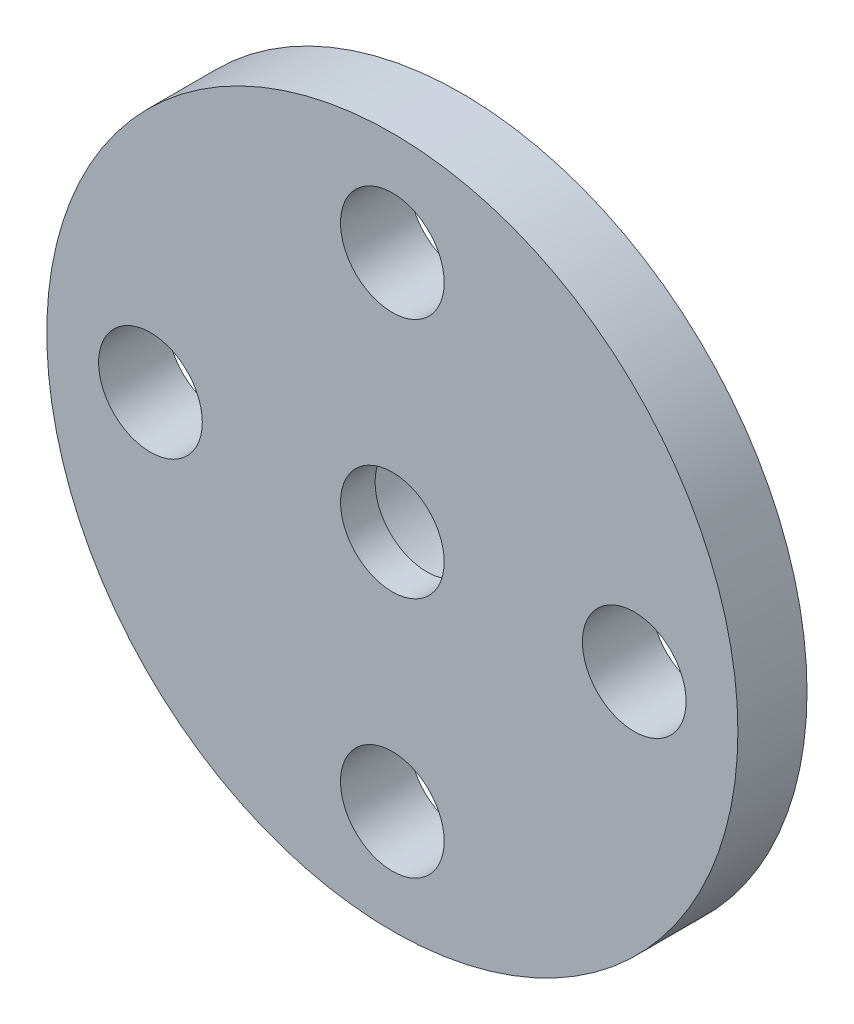
ISO-10303-21;
HEADER;
FILE_DESCRIPTION(('STEP AP214'),'2;1');
FILE_NAME('part.step','',(''),(''),'','','');
FILE_SCHEMA(('AUTOMOTIVE_DESIGN { 1 0 10303 214 1 1 1 1 }'));
ENDSEC;
DATA;
#1=APPLICATION_CONTEXT('core data for automotive mechanical design processes');
#2=APPLICATION_PROTOCOL_DEFINITION('international standard','automotive_design',2000,#1);
#3=PRODUCT_CONTEXT('',#1,'mechanical');
#4=PRODUCT('Part','Part','',(#3));
#5=PRODUCT_RELATED_PRODUCT_CATEGORY('part','',(#4));
#6=PRODUCT_DEFINITION_FORMATION('','',#4);
#7=PRODUCT_DEFINITION_CONTEXT('part definition',#1,'design');
#8=PRODUCT_DEFINITION('design','',#6,#7);
#9=PRODUCT_DEFINITION_SHAPE('','',#8);
#10=(LENGTH_UNIT() NAMED_UNIT(*) SI_UNIT(.MILLI.,.METRE.));
#11=(NAMED_UNIT(*) PLANE_ANGLE_UNIT() SI_UNIT($,.RADIAN.));
#12=(NAMED_UNIT(*) SI_UNIT($,.STERADIAN.) SOLID_ANGLE_UNIT());
#13=UNCERTAINTY_MEASURE_WITH_UNIT(LENGTH_MEASURE(1.E-05),#10,'distance_accuracy_value','');
#14=(GEOMETRIC_REPRESENTATION_CONTEXT(3) GLOBAL_UNCERTAINTY_ASSIGNED_CONTEXT((#13)) GLOBAL_UNIT_ASSIGNED_CONTEXT((#10,
#11,#12)) REPRESENTATION_CONTEXT('',''));
#15=CARTESIAN_POINT('',(0.,0.,0.));
#16=DIRECTION('',(0.,0.,1.));
#17=DIRECTION('',(1.,0.,0.));
#18=AXIS2_PLACEMENT_3D('',#15,#16,#17);
#19=CARTESIAN_POINT('',(0.,0.,2.));
#20=DIRECTION('',(0.,0.,-1.));
#21=DIRECTION('',(-1.,0.,0.));
#22=AXIS2_PLACEMENT_3D('',#19,#20,#21);
#23=CYLINDRICAL_SURFACE('',#22,1.5);
#24=CARTESIAN_POINT('',(0.,0.,2.));
#25=DIRECTION('',(0.,0.,1.));
#26=DIRECTION('',(1.,0.,0.));
#27=AXIS2_PLACEMENT_3D('',#24,#25,#26);
#28=CIRCLE('',#27,1.5);
#29=CARTESIAN_POINT('',(1.5,0.,2.));
#30=VERTEX_POINT('',#29);
#31=EDGE_CURVE('E47',#30,#30,#28,.T.);
#32=ORIENTED_EDGE('',*,*,#31,.T.);
#33=EDGE_LOOP('',(#32));
#34=FACE_BOUND('',#33,.T.);
#35=CARTESIAN_POINT('',(0.,0.,1.));
#36=DIRECTION('',(0.,0.,-1.));
#37=DIRECTION('',(-1.,0.,0.));
#38=AXIS2_PLACEMENT_3D('',#35,#36,#37);
#39=CIRCLE('',#38,1.5);
#40=CARTESIAN_POINT('',(-1.5,0.,1.));
#41=VERTEX_POINT('',#40);
#42=EDGE_CURVE('E38',#41,#41,#39,.T.);
#43=ORIENTED_EDGE('',*,*,#42,.T.);
#44=EDGE_LOOP('',(#43));
#45=FACE_BOUND('',#44,.T.);
#46=ADVANCED_FACE('F34',(#34,#45),#23,.F.);
#47=CARTESIAN_POINT('',(0.,0.,2.));
#48=DIRECTION('',(0.,0.,1.));
#49=DIRECTION('',(1.,0.,0.));
#50=AXIS2_PLACEMENT_3D('',#47,#48,#49);
#51=PLANE('',#50);
#52=CARTESIAN_POINT('',(0.,7.,2.));
#53=DIRECTION('',(0.,0.,1.));
#54=DIRECTION('',(1.,0.,0.));
#55=AXIS2_PLACEMENT_3D('',#52,#53,#54);
#56=CIRCLE('',#55,1.5);
#57=CARTESIAN_POINT('',(1.5,7.,2.));
#58=VERTEX_POINT('',#57);
#59=EDGE_CURVE('E61',#58,#58,#56,.T.);
#60=ORIENTED_EDGE('',*,*,#59,.F.);
#61=EDGE_LOOP('',(#60));
#62=FACE_BOUND('',#61,.T.);
#63=CARTESIAN_POINT('',(-7.,0.,2.));
#64=DIRECTION('',(0.,0.,1.));
#65=DIRECTION('',(1.,0.,0.));
#66=AXIS2_PLACEMENT_3D('',#63,#64,#65);
#67=CIRCLE('',#66,1.5);
#68=CARTESIAN_POINT('',(-5.5,0.,2.));
#69=VERTEX_POINT('',#68);
#70=EDGE_CURVE('E51',#69,#69,#67,.T.);
#71=ORIENTED_EDGE('',*,*,#70,.F.);
#72=EDGE_LOOP('',(#71));
#73=FACE_BOUND('',#72,.T.);
#74=CARTESIAN_POINT('',(0.,0.,2.));
#75=DIRECTION('',(0.,0.,1.));
#76=DIRECTION('',(1.,0.,0.));
#77=AXIS2_PLACEMENT_3D('',#74,#75,#76);
#78=CIRCLE('',#77,10.);
#79=CARTESIAN_POINT('',(10.,0.,2.));
#80=VERTEX_POINT('',#79);
#81=EDGE_CURVE('E10',#80,#80,#78,.T.);
#82=ORIENTED_EDGE('',*,*,#81,.T.);
#83=EDGE_LOOP('',(#82));
#84=FACE_BOUND('',#83,.T.);
#85=ORIENTED_EDGE('',*,*,#31,.F.);
#86=EDGE_LOOP('',(#85));
#87=FACE_BOUND('',#86,.T.);
#88=CARTESIAN_POINT('',(7.,0.,2.));
#89=DIRECTION('',(0.,0.,1.));
#90=DIRECTION('',(1.,0.,0.));
#91=AXIS2_PLACEMENT_3D('',#88,#89,#90);
#92=CIRCLE('',#91,1.5);
#93=CARTESIAN_POINT('',(8.5,0.,2.));
#94=VERTEX_POINT('',#93);
#95=EDGE_CURVE('E55',#94,#94,#92,.T.);
#96=ORIENTED_EDGE('',*,*,#95,.F.);
#97=EDGE_LOOP('',(#96));
#98=FACE_BOUND('',#97,.T.);
#99=CARTESIAN_POINT('',(0.,-7.,2.));
#100=DIRECTION('',(0.,0.,1.));
#101=DIRECTION('',(1.,0.,0.));
#102=AXIS2_PLACEMENT_3D('',#99,#100,#101);
#103=CIRCLE('',#102,1.5);
#104=CARTESIAN_POINT('',(1.5,-7.,2.));
#105=VERTEX_POINT('',#104);
#106=EDGE_CURVE('E67',#105,#105,#103,.T.);
#107=ORIENTED_EDGE('',*,*,#106,.F.);
#108=EDGE_LOOP('',(#107));
#109=FACE_BOUND('',#108,.T.);
#110=ADVANCED_FACE('F103',(#62,#73,#84,#87,#98,#109),#51,.T.);
#111=CARTESIAN_POINT('',(0.,0.,0.));
#112=DIRECTION('',(0.,0.,1.));
#113=DIRECTION('',(1.,0.,0.));
#114=AXIS2_PLACEMENT_3D('',#111,#112,#113);
#115=PLANE('',#114);
#116=CARTESIAN_POINT('',(0.,0.,0.));
#117=DIRECTION('',(0.,0.,1.));
#118=DIRECTION('',(1.,0.,0.));
#119=AXIS2_PLACEMENT_3D('',#116,#117,#118);
#120=CIRCLE('',#119,4.5);
#121=CARTESIAN_POINT('',(4.5,0.,0.));
#122=VERTEX_POINT('',#121);
#123=EDGE_CURVE('E76',#122,#122,#120,.T.);
#124=ORIENTED_EDGE('',*,*,#123,.T.);
#125=EDGE_LOOP('',(#124));
#126=FACE_BOUND('',#125,.T.);
#127=CARTESIAN_POINT('',(0.,0.,0.));
#128=DIRECTION('',(0.,0.,1.));
#129=DIRECTION('',(1.,0.,0.));
#130=AXIS2_PLACEMENT_3D('',#127,#128,#129);
#131=CIRCLE('',#130,10.);
#132=CARTESIAN_POINT('',(10.,0.,0.));
#133=VERTEX_POINT('',#132);
#134=EDGE_CURVE('E42',#133,#133,#131,.T.);
#135=ORIENTED_EDGE('',*,*,#134,.F.);
#136=EDGE_LOOP('',(#135));
#137=FACE_BOUND('',#136,.T.);
#138=CARTESIAN_POINT('',(-7.,0.,0.));
#139=DIRECTION('',(0.,0.,1.));
#140=DIRECTION('',(1.,0.,0.));
#141=AXIS2_PLACEMENT_3D('',#138,#139,#140);
#142=CIRCLE('',#141,1.5);
#143=CARTESIAN_POINT('',(-5.5,0.,0.));
#144=VERTEX_POINT('',#143);
#145=EDGE_CURVE('E52',#144,#144,#142,.T.);
#146=ORIENTED_EDGE('',*,*,#145,.T.);
#147=EDGE_LOOP('',(#146));
#148=FACE_BOUND('',#147,.T.);
#149=CARTESIAN_POINT('',(7.,0.,0.));
#150=DIRECTION('',(0.,0.,1.));
#151=DIRECTION('',(1.,0.,0.));
#152=AXIS2_PLACEMENT_3D('',#149,#150,#151);
#153=CIRCLE('',#152,1.5);
#154=CARTESIAN_POINT('',(8.5,0.,0.));
#155=VERTEX_POINT('',#154);
#156=EDGE_CURVE('E58',#155,#155,#153,.T.);
#157=ORIENTED_EDGE('',*,*,#156,.T.);
#158=EDGE_LOOP('',(#157));
#159=FACE_BOUND('',#158,.T.);
#160=CARTESIAN_POINT('',(0.,7.,0.));
#161=DIRECTION('',(0.,0.,1.));
#162=DIRECTION('',(1.,0.,0.));
#163=AXIS2_PLACEMENT_3D('',#160,#161,#162);
#164=CIRCLE('',#163,1.5);
#165=CARTESIAN_POINT('',(1.5,7.,0.));
#166=VERTEX_POINT('',#165);
#167=EDGE_CURVE('E64',#166,#166,#164,.T.);
#168=ORIENTED_EDGE('',*,*,#167,.T.);
#169=EDGE_LOOP('',(#168));
#170=FACE_BOUND('',#169,.T.);
#171=CARTESIAN_POINT('',(0.,-7.,0.));
#172=DIRECTION('',(0.,0.,1.));
#173=DIRECTION('',(1.,0.,0.));
#174=AXIS2_PLACEMENT_3D('',#171,#172,#173);
#175=CIRCLE('',#174,1.5);
#176=CARTESIAN_POINT('',(1.5,-7.,0.));
#177=VERTEX_POINT('',#176);
#178=EDGE_CURVE('E70',#177,#177,#175,.T.);
#179=ORIENTED_EDGE('',*,*,#178,.T.);
#180=EDGE_LOOP('',(#179));
#181=FACE_BOUND('',#180,.T.);
#182=ADVANCED_FACE('F109',(#126,#137,#148,#159,#170,#181),#115,.F.);
#183=CARTESIAN_POINT('',(0.,0.,2.));
#184=DIRECTION('',(0.,0.,-1.));
#185=DIRECTION('',(-1.,0.,0.));
#186=AXIS2_PLACEMENT_3D('',#183,#184,#185);
#187=CYLINDRICAL_SURFACE('',#186,10.);
#188=ORIENTED_EDGE('',*,*,#81,.F.);
#189=EDGE_LOOP('',(#188));
#190=FACE_BOUND('',#189,.T.);
#191=ORIENTED_EDGE('',*,*,#134,.T.);
#192=EDGE_LOOP('',(#191));
#193=FACE_BOUND('',#192,.T.);
#194=ADVANCED_FACE('F36',(#190,#193),#187,.T.);
#195=CARTESIAN_POINT('',(-7.,0.,2.));
#196=DIRECTION('',(0.,0.,-1.));
#197=DIRECTION('',(-1.,0.,0.));
#198=AXIS2_PLACEMENT_3D('',#195,#196,#197);
#199=CYLINDRICAL_SURFACE('',#198,1.5);
#200=ORIENTED_EDGE('',*,*,#70,.T.);
#201=EDGE_LOOP('',(#200));
#202=FACE_BOUND('',#201,.T.);
#203=ORIENTED_EDGE('',*,*,#145,.F.);
#204=EDGE_LOOP('',(#203));
#205=FACE_BOUND('',#204,.T.);
#206=ADVANCED_FACE('F113',(#202,#205),#199,.F.);
#207=CARTESIAN_POINT('',(7.,0.,2.));
#208=DIRECTION('',(0.,0.,-1.));
#209=DIRECTION('',(-1.,0.,0.));
#210=AXIS2_PLACEMENT_3D('',#207,#208,#209);
#211=CYLINDRICAL_SURFACE('',#210,1.5);
#212=ORIENTED_EDGE('',*,*,#95,.T.);
#213=EDGE_LOOP('',(#212));
#214=FACE_BOUND('',#213,.T.);
#215=ORIENTED_EDGE('',*,*,#156,.F.);
#216=EDGE_LOOP('',(#215));
#217=FACE_BOUND('',#216,.T.);
#218=ADVANCED_FACE('F145',(#214,#217),#211,.F.);
#219=CARTESIAN_POINT('',(0.,7.,2.));
#220=DIRECTION('',(0.,0.,-1.));
#221=DIRECTION('',(-1.,0.,0.));
#222=AXIS2_PLACEMENT_3D('',#219,#220,#221);
#223=CYLINDRICAL_SURFACE('',#222,1.5);
#224=ORIENTED_EDGE('',*,*,#59,.T.);
#225=EDGE_LOOP('',(#224));
#226=FACE_BOUND('',#225,.T.);
#227=ORIENTED_EDGE('',*,*,#167,.F.);
#228=EDGE_LOOP('',(#227));
#229=FACE_BOUND('',#228,.T.);
#230=ADVANCED_FACE('F136',(#226,#229),#223,.F.);
#231=CARTESIAN_POINT('',(0.,-7.,2.));
#232=DIRECTION('',(0.,0.,-1.));
#233=DIRECTION('',(-1.,0.,0.));
#234=AXIS2_PLACEMENT_3D('',#231,#232,#233);
#235=CYLINDRICAL_SURFACE('',#234,1.5);
#236=ORIENTED_EDGE('',*,*,#106,.T.);
#237=EDGE_LOOP('',(#236));
#238=FACE_BOUND('',#237,.T.);
#239=ORIENTED_EDGE('',*,*,#178,.F.);
#240=EDGE_LOOP('',(#239));
#241=FACE_BOUND('',#240,.T.);
#242=ADVANCED_FACE('F133',(#238,#241),#235,.F.);
#243=CARTESIAN_POINT('',(0.,0.,-2.5));
#244=DIRECTION('',(0.,0.,1.));
#245=DIRECTION('',(1.,0.,0.));
#246=AXIS2_PLACEMENT_3D('',#243,#244,#245);
#247=CYLINDRICAL_SURFACE('',#246,4.5);
#248=CARTESIAN_POINT('',(0.,0.,-2.5));
#249=DIRECTION('',(0.,0.,1.));
#250=DIRECTION('',(1.,0.,0.));
#251=AXIS2_PLACEMENT_3D('',#248,#249,#250);
#252=CIRCLE('',#251,4.5);
#253=CARTESIAN_POINT('',(4.5,0.,-2.5));
#254=VERTEX_POINT('',#253);
#255=EDGE_CURVE('E73',#254,#254,#252,.T.);
#256=ORIENTED_EDGE('',*,*,#255,.T.);
#257=EDGE_LOOP('',(#256));
#258=FACE_BOUND('',#257,.T.);
#259=ORIENTED_EDGE('',*,*,#123,.F.);
#260=EDGE_LOOP('',(#259));
#261=FACE_BOUND('',#260,.T.);
#262=ADVANCED_FACE('F135',(#258,#261),#247,.T.);
#263=CARTESIAN_POINT('',(0.,0.,-2.5));
#264=DIRECTION('',(0.,0.,1.));
#265=DIRECTION('',(1.,0.,0.));
#266=AXIS2_PLACEMENT_3D('',#263,#264,#265);
#267=PLANE('',#266);
#268=CARTESIAN_POINT('',(0.,0.,-2.5));
#269=DIRECTION('',(0.,0.,1.));
#270=DIRECTION('',(1.,0.,0.));
#271=AXIS2_PLACEMENT_3D('',#268,#269,#270);
#272=CIRCLE('',#271,2.75);
#273=CARTESIAN_POINT('',(2.75,0.,-2.5));
#274=VERTEX_POINT('',#273);
#275=EDGE_CURVE('E79',#274,#274,#272,.T.);
#276=ORIENTED_EDGE('',*,*,#275,.T.);
#277=EDGE_LOOP('',(#276));
#278=FACE_BOUND('',#277,.T.);
#279=ORIENTED_EDGE('',*,*,#255,.F.);
#280=EDGE_LOOP('',(#279));
#281=FACE_BOUND('',#280,.T.);
#282=ADVANCED_FACE('F99',(#278,#281),#267,.F.);
#283=CARTESIAN_POINT('',(0.,0.,-2.5));
#284=DIRECTION('',(0.,0.,1.));
#285=DIRECTION('',(1.,0.,0.));
#286=AXIS2_PLACEMENT_3D('',#283,#284,#285);
#287=CYLINDRICAL_SURFACE('',#286,2.75);
#288=ORIENTED_EDGE('',*,*,#275,.F.);
#289=EDGE_LOOP('',(#288));
#290=FACE_BOUND('',#289,.T.);
#291=CARTESIAN_POINT('',(0.,0.,1.));
#292=DIRECTION('',(0.,0.,-1.));
#293=DIRECTION('',(-1.,0.,0.));
#294=AXIS2_PLACEMENT_3D('',#291,#292,#293);
#295=CIRCLE('',#294,2.75);
#296=CARTESIAN_POINT('',(-2.75,0.,1.));
#297=VERTEX_POINT('',#296);
#298=EDGE_CURVE('E84',#297,#297,#295,.T.);
#299=ORIENTED_EDGE('',*,*,#298,.F.);
#300=EDGE_LOOP('',(#299));
#301=FACE_BOUND('',#300,.T.);
#302=ADVANCED_FACE('F94',(#290,#301),#287,.F.);
#303=CARTESIAN_POINT('',(0.,0.,1.));
#304=DIRECTION('',(0.,0.,-1.));
#305=DIRECTION('',(-1.,0.,0.));
#306=AXIS2_PLACEMENT_3D('',#303,#304,#305);
#307=PLANE('',#306);
#308=ORIENTED_EDGE('',*,*,#42,.F.);
#309=EDGE_LOOP('',(#308));
#310=FACE_BOUND('',#309,.T.);
#311=ORIENTED_EDGE('',*,*,#298,.T.);
#312=EDGE_LOOP('',(#311));
#313=FACE_BOUND('',#312,.T.);
#314=ADVANCED_FACE('F92',(#310,#313),#307,.T.);
#315=CLOSED_SHELL('',(#46,#110,#182,#194,#206,#218,#230,#242,#262,#282,#302,#314));
#316=MANIFOLD_SOLID_BREP('B2',#315);
#317=ADVANCED_BREP_SHAPE_REPRESENTATION('',(#18,#316),#14);
#318=SHAPE_DEFINITION_REPRESENTATION(#9,#317);
ENDSEC;
END-ISO-10303-21;
